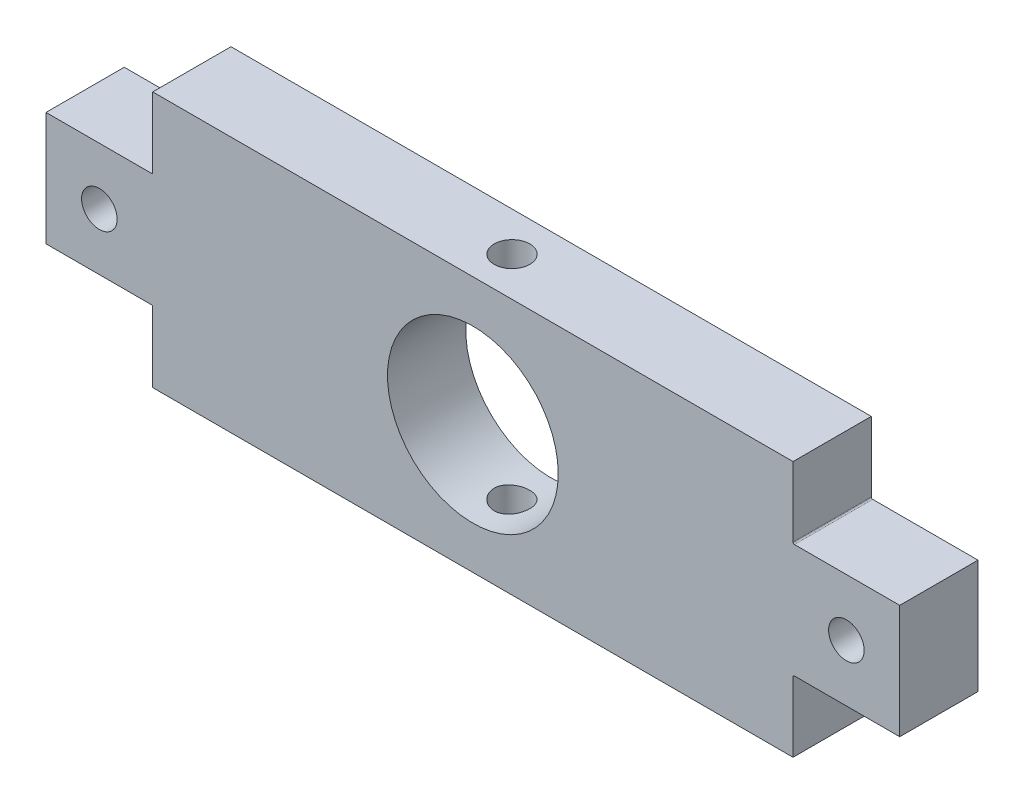
ISO-10303-21;
HEADER;
FILE_DESCRIPTION(('STEP AP214'),'2;1');
FILE_NAME('part.step','',(''),(''),'','','');
FILE_SCHEMA(('AUTOMOTIVE_DESIGN { 1 0 10303 214 1 1 1 1 }'));
ENDSEC;
DATA;
#1=APPLICATION_CONTEXT('core data for automotive mechanical design processes');
#2=APPLICATION_PROTOCOL_DEFINITION('international standard','automotive_design',2000,#1);
#3=PRODUCT_CONTEXT('',#1,'mechanical');
#4=PRODUCT('Part','Part','',(#3));
#5=PRODUCT_RELATED_PRODUCT_CATEGORY('part','',(#4));
#6=PRODUCT_DEFINITION_FORMATION('','',#4);
#7=PRODUCT_DEFINITION_CONTEXT('part definition',#1,'design');
#8=PRODUCT_DEFINITION('design','',#6,#7);
#9=PRODUCT_DEFINITION_SHAPE('','',#8);
#10=(LENGTH_UNIT() NAMED_UNIT(*) SI_UNIT(.MILLI.,.METRE.));
#11=(NAMED_UNIT(*) PLANE_ANGLE_UNIT() SI_UNIT($,.RADIAN.));
#12=(NAMED_UNIT(*) SI_UNIT($,.STERADIAN.) SOLID_ANGLE_UNIT());
#13=UNCERTAINTY_MEASURE_WITH_UNIT(LENGTH_MEASURE(1.E-05),#10,'distance_accuracy_value','');
#14=(GEOMETRIC_REPRESENTATION_CONTEXT(3) GLOBAL_UNCERTAINTY_ASSIGNED_CONTEXT((#13)) GLOBAL_UNIT_ASSIGNED_CONTEXT((#10,
#11,#12)) REPRESENTATION_CONTEXT('',''));
#15=CARTESIAN_POINT('',(0.,0.,0.));
#16=DIRECTION('',(0.,0.,1.));
#17=DIRECTION('',(1.,0.,0.));
#18=AXIS2_PLACEMENT_3D('',#15,#16,#17);
#19=CARTESIAN_POINT('',(45.,-18.,11.));
#20=DIRECTION('',(1.,0.,0.));
#21=DIRECTION('',(0.,1.,0.));
#22=AXIS2_PLACEMENT_3D('',#19,#20,#21);
#23=PLANE('',#22);
#24=DIRECTION('',(0.,-1.,0.));
#25=VECTOR('',#24,1.);
#26=CARTESIAN_POINT('',(45.,-18.,0.));
#27=LINE('',#26,#25);
#28=CARTESIAN_POINT('',(45.,-8.20000000000001,0.));
#29=VERTEX_POINT('',#28);
#30=CARTESIAN_POINT('',(45.,-18.,0.));
#31=VERTEX_POINT('',#30);
#32=EDGE_CURVE('E203',#29,#31,#27,.T.);
#33=ORIENTED_EDGE('',*,*,#32,.F.);
#34=DIRECTION('',(0.,0.,-1.));
#35=VECTOR('',#34,1.);
#36=CARTESIAN_POINT('',(45.,-8.20000000000001,11.));
#37=LINE('',#36,#35);
#38=CARTESIAN_POINT('',(45.,-8.20000000000001,11.));
#39=VERTEX_POINT('',#38);
#40=EDGE_CURVE('E157',#29,#39,#37,.F.);
#41=ORIENTED_EDGE('',*,*,#40,.T.);
#42=DIRECTION('',(0.,-1.,0.));
#43=VECTOR('',#42,1.);
#44=CARTESIAN_POINT('',(45.,-18.,11.));
#45=LINE('',#44,#43);
#46=CARTESIAN_POINT('',(45.,-18.,11.));
#47=VERTEX_POINT('',#46);
#48=EDGE_CURVE('E151',#39,#47,#45,.T.);
#49=ORIENTED_EDGE('',*,*,#48,.T.);
#50=DIRECTION('',(0.,0.,-1.));
#51=VECTOR('',#50,1.);
#52=CARTESIAN_POINT('',(45.,-18.,11.));
#53=LINE('',#52,#51);
#54=EDGE_CURVE('E154',#47,#31,#53,.T.);
#55=ORIENTED_EDGE('',*,*,#54,.T.);
#56=EDGE_LOOP('',(#33,#41,#49,#55));
#57=FACE_BOUND('',#56,.T.);
#58=ADVANCED_FACE('F40',(#57),#23,.T.);
#59=CARTESIAN_POINT('',(45.,-8.00000000000001,11.));
#60=DIRECTION('',(0.,-1.,0.));
#61=DIRECTION('',(1.,0.,0.));
#62=AXIS2_PLACEMENT_3D('',#59,#60,#61);
#63=PLANE('',#62);
#64=DIRECTION('',(-1.,0.,0.));
#65=VECTOR('',#64,1.);
#66=CARTESIAN_POINT('',(45.,-8.00000000000001,11.));
#67=LINE('',#66,#65);
#68=CARTESIAN_POINT('',(60.,-7.99999999999999,11.));
#69=VERTEX_POINT('',#68);
#70=CARTESIAN_POINT('',(45.2,-8.00000000000001,11.));
#71=VERTEX_POINT('',#70);
#72=EDGE_CURVE('E170',#69,#71,#67,.T.);
#73=ORIENTED_EDGE('',*,*,#72,.T.);
#74=DIRECTION('',(0.,0.,-1.));
#75=VECTOR('',#74,1.);
#76=CARTESIAN_POINT('',(45.2,-8.00000000000001,0.));
#77=LINE('',#76,#75);
#78=CARTESIAN_POINT('',(45.2,-8.00000000000001,0.));
#79=VERTEX_POINT('',#78);
#80=EDGE_CURVE('E234',#71,#79,#77,.T.);
#81=ORIENTED_EDGE('',*,*,#80,.T.);
#82=DIRECTION('',(-1.,0.,0.));
#83=VECTOR('',#82,1.);
#84=CARTESIAN_POINT('',(45.,-8.00000000000001,0.));
#85=LINE('',#84,#83);
#86=CARTESIAN_POINT('',(60.,-7.99999999999999,0.));
#87=VERTEX_POINT('',#86);
#88=EDGE_CURVE('E162',#87,#79,#85,.T.);
#89=ORIENTED_EDGE('',*,*,#88,.F.);
#90=DIRECTION('',(0.,0.,-1.));
#91=VECTOR('',#90,1.);
#92=CARTESIAN_POINT('',(60.,-7.99999999999999,11.));
#93=LINE('',#92,#91);
#94=EDGE_CURVE('E232',#69,#87,#93,.T.);
#95=ORIENTED_EDGE('',*,*,#94,.F.);
#96=EDGE_LOOP('',(#73,#81,#89,#95));
#97=FACE_BOUND('',#96,.T.);
#98=ADVANCED_FACE('F290',(#97),#63,.T.);
#99=CARTESIAN_POINT('',(60.,-7.99999999999999,11.));
#100=DIRECTION('',(1.,0.,0.));
#101=DIRECTION('',(0.,0.,-1.));
#102=AXIS2_PLACEMENT_3D('',#99,#100,#101);
#103=PLANE('',#102);
#104=DIRECTION('',(0.,-1.,0.));
#105=VECTOR('',#104,1.);
#106=CARTESIAN_POINT('',(60.,-7.99999999999999,0.));
#107=LINE('',#106,#105);
#108=CARTESIAN_POINT('',(60.,8.,0.));
#109=VERTEX_POINT('',#108);
#110=EDGE_CURVE('E227',#109,#87,#107,.T.);
#111=ORIENTED_EDGE('',*,*,#110,.F.);
#112=DIRECTION('',(0.,0.,-1.));
#113=VECTOR('',#112,1.);
#114=CARTESIAN_POINT('',(60.,8.,11.));
#115=LINE('',#114,#113);
#116=CARTESIAN_POINT('',(60.,8.,11.));
#117=VERTEX_POINT('',#116);
#118=EDGE_CURVE('E235',#117,#109,#115,.T.);
#119=ORIENTED_EDGE('',*,*,#118,.F.);
#120=DIRECTION('',(0.,-1.,0.));
#121=VECTOR('',#120,1.);
#122=CARTESIAN_POINT('',(60.,-7.99999999999999,11.));
#123=LINE('',#122,#121);
#124=EDGE_CURVE('E198',#117,#69,#123,.T.);
#125=ORIENTED_EDGE('',*,*,#124,.T.);
#126=ORIENTED_EDGE('',*,*,#94,.T.);
#127=EDGE_LOOP('',(#111,#119,#125,#126));
#128=FACE_BOUND('',#127,.T.);
#129=ADVANCED_FACE('F295',(#128),#103,.T.);
#130=CARTESIAN_POINT('',(60.,8.,11.));
#131=DIRECTION('',(0.,1.,0.));
#132=DIRECTION('',(-1.,0.,0.));
#133=AXIS2_PLACEMENT_3D('',#130,#131,#132);
#134=PLANE('',#133);
#135=DIRECTION('',(1.,0.,0.));
#136=VECTOR('',#135,1.);
#137=CARTESIAN_POINT('',(60.,8.,0.));
#138=LINE('',#137,#136);
#139=CARTESIAN_POINT('',(45.2,7.99999999999999,0.));
#140=VERTEX_POINT('',#139);
#141=EDGE_CURVE('E225',#140,#109,#138,.T.);
#142=ORIENTED_EDGE('',*,*,#141,.F.);
#143=DIRECTION('',(0.,0.,-1.));
#144=VECTOR('',#143,1.);
#145=CARTESIAN_POINT('',(45.2,7.99999999999999,11.));
#146=LINE('',#145,#144);
#147=CARTESIAN_POINT('',(45.2,7.99999999999999,11.));
#148=VERTEX_POINT('',#147);
#149=EDGE_CURVE('E337',#140,#148,#146,.F.);
#150=ORIENTED_EDGE('',*,*,#149,.T.);
#151=DIRECTION('',(1.,0.,0.));
#152=VECTOR('',#151,1.);
#153=CARTESIAN_POINT('',(60.,8.,11.));
#154=LINE('',#153,#152);
#155=EDGE_CURVE('E196',#148,#117,#154,.T.);
#156=ORIENTED_EDGE('',*,*,#155,.T.);
#157=ORIENTED_EDGE('',*,*,#118,.T.);
#158=EDGE_LOOP('',(#142,#150,#156,#157));
#159=FACE_BOUND('',#158,.T.);
#160=ADVANCED_FACE('F444',(#159),#134,.T.);
#161=CARTESIAN_POINT('',(45.,7.99999999999999,11.));
#162=DIRECTION('',(1.,0.,0.));
#163=DIRECTION('',(0.,1.,0.));
#164=AXIS2_PLACEMENT_3D('',#161,#162,#163);
#165=PLANE('',#164);
#166=DIRECTION('',(0.,-1.,0.));
#167=VECTOR('',#166,1.);
#168=CARTESIAN_POINT('',(45.,7.99999999999999,11.));
#169=LINE('',#168,#167);
#170=CARTESIAN_POINT('',(45.,18.,11.));
#171=VERTEX_POINT('',#170);
#172=CARTESIAN_POINT('',(45.,8.19999999999999,11.));
#173=VERTEX_POINT('',#172);
#174=EDGE_CURVE('E193',#171,#173,#169,.T.);
#175=ORIENTED_EDGE('',*,*,#174,.T.);
#176=DIRECTION('',(0.,0.,-1.));
#177=VECTOR('',#176,1.);
#178=CARTESIAN_POINT('',(45.,8.19999999999999,0.));
#179=LINE('',#178,#177);
#180=CARTESIAN_POINT('',(45.,8.19999999999999,0.));
#181=VERTEX_POINT('',#180);
#182=EDGE_CURVE('E339',#173,#181,#179,.T.);
#183=ORIENTED_EDGE('',*,*,#182,.T.);
#184=DIRECTION('',(0.,-1.,0.));
#185=VECTOR('',#184,1.);
#186=CARTESIAN_POINT('',(45.,7.99999999999999,0.));
#187=LINE('',#186,#185);
#188=CARTESIAN_POINT('',(45.,18.,0.));
#189=VERTEX_POINT('',#188);
#190=EDGE_CURVE('E222',#189,#181,#187,.T.);
#191=ORIENTED_EDGE('',*,*,#190,.F.);
#192=DIRECTION('',(0.,0.,-1.));
#193=VECTOR('',#192,1.);
#194=CARTESIAN_POINT('',(45.,18.,11.));
#195=LINE('',#194,#193);
#196=EDGE_CURVE('E238',#171,#189,#195,.T.);
#197=ORIENTED_EDGE('',*,*,#196,.F.);
#198=EDGE_LOOP('',(#175,#183,#191,#197));
#199=FACE_BOUND('',#198,.T.);
#200=ADVANCED_FACE('F360',(#199),#165,.T.);
#201=CARTESIAN_POINT('',(45.,18.,11.));
#202=DIRECTION('',(0.,1.,0.));
#203=DIRECTION('',(-1.,0.,0.));
#204=AXIS2_PLACEMENT_3D('',#201,#202,#203);
#205=PLANE('',#204);
#206=CARTESIAN_POINT('',(0.,18.,5.5));
#207=DIRECTION('',(0.,-1.,0.));
#208=DIRECTION('',(0.,0.,-1.));
#209=AXIS2_PLACEMENT_3D('',#206,#207,#208);
#210=CIRCLE('',#209,2.5);
#211=CARTESIAN_POINT('',(0.,18.,3.));
#212=VERTEX_POINT('',#211);
#213=EDGE_CURVE('E258',#212,#212,#210,.T.);
#214=ORIENTED_EDGE('',*,*,#213,.T.);
#215=EDGE_LOOP('',(#214));
#216=FACE_BOUND('',#215,.T.);
#217=DIRECTION('',(1.,0.,0.));
#218=VECTOR('',#217,1.);
#219=CARTESIAN_POINT('',(45.,18.,0.));
#220=LINE('',#219,#218);
#221=CARTESIAN_POINT('',(-45.,18.,0.));
#222=VERTEX_POINT('',#221);
#223=EDGE_CURVE('E219',#222,#189,#220,.T.);
#224=ORIENTED_EDGE('',*,*,#223,.F.);
#225=DIRECTION('',(0.,0.,-1.));
#226=VECTOR('',#225,1.);
#227=CARTESIAN_POINT('',(-45.,18.,11.));
#228=LINE('',#227,#226);
#229=CARTESIAN_POINT('',(-45.,18.,11.));
#230=VERTEX_POINT('',#229);
#231=EDGE_CURVE('E240',#230,#222,#228,.T.);
#232=ORIENTED_EDGE('',*,*,#231,.F.);
#233=DIRECTION('',(1.,0.,0.));
#234=VECTOR('',#233,1.);
#235=CARTESIAN_POINT('',(45.,18.,11.));
#236=LINE('',#235,#234);
#237=EDGE_CURVE('E190',#230,#171,#236,.T.);
#238=ORIENTED_EDGE('',*,*,#237,.T.);
#239=ORIENTED_EDGE('',*,*,#196,.T.);
#240=EDGE_LOOP('',(#224,#232,#238,#239));
#241=FACE_BOUND('',#240,.T.);
#242=ADVANCED_FACE('F365',(#216,#241),#205,.T.);
#243=CARTESIAN_POINT('',(-45.,18.,11.));
#244=DIRECTION('',(-1.,0.,0.));
#245=DIRECTION('',(0.,0.,1.));
#246=AXIS2_PLACEMENT_3D('',#243,#244,#245);
#247=PLANE('',#246);
#248=DIRECTION('',(0.,1.,0.));
#249=VECTOR('',#248,1.);
#250=CARTESIAN_POINT('',(-45.,18.,0.));
#251=LINE('',#250,#249);
#252=CARTESIAN_POINT('',(-45.,8.20000000000002,0.));
#253=VERTEX_POINT('',#252);
#254=EDGE_CURVE('E217',#253,#222,#251,.T.);
#255=ORIENTED_EDGE('',*,*,#254,.F.);
#256=DIRECTION('',(0.,0.,-1.));
#257=VECTOR('',#256,1.);
#258=CARTESIAN_POINT('',(-45.,8.20000000000002,11.));
#259=LINE('',#258,#257);
#260=CARTESIAN_POINT('',(-45.,8.20000000000002,11.));
#261=VERTEX_POINT('',#260);
#262=EDGE_CURVE('E314',#253,#261,#259,.F.);
#263=ORIENTED_EDGE('',*,*,#262,.T.);
#264=DIRECTION('',(0.,1.,0.));
#265=VECTOR('',#264,1.);
#266=CARTESIAN_POINT('',(-45.,18.,11.));
#267=LINE('',#266,#265);
#268=EDGE_CURVE('E188',#261,#230,#267,.T.);
#269=ORIENTED_EDGE('',*,*,#268,.T.);
#270=ORIENTED_EDGE('',*,*,#231,.T.);
#271=EDGE_LOOP('',(#255,#263,#269,#270));
#272=FACE_BOUND('',#271,.T.);
#273=ADVANCED_FACE('F368',(#272),#247,.T.);
#274=CARTESIAN_POINT('',(-45.,8.00000000000001,11.));
#275=DIRECTION('',(0.,1.,0.));
#276=DIRECTION('',(-1.,0.,0.));
#277=AXIS2_PLACEMENT_3D('',#274,#275,#276);
#278=PLANE('',#277);
#279=DIRECTION('',(1.,0.,0.));
#280=VECTOR('',#279,1.);
#281=CARTESIAN_POINT('',(-45.,8.00000000000001,11.));
#282=LINE('',#281,#280);
#283=CARTESIAN_POINT('',(-60.,8.,11.));
#284=VERTEX_POINT('',#283);
#285=CARTESIAN_POINT('',(-45.2,8.00000000000001,11.));
#286=VERTEX_POINT('',#285);
#287=EDGE_CURVE('E185',#284,#286,#282,.T.);
#288=ORIENTED_EDGE('',*,*,#287,.T.);
#289=DIRECTION('',(0.,0.,-1.));
#290=VECTOR('',#289,1.);
#291=CARTESIAN_POINT('',(-45.2,8.00000000000001,0.));
#292=LINE('',#291,#290);
#293=CARTESIAN_POINT('',(-45.2,8.00000000000001,0.));
#294=VERTEX_POINT('',#293);
#295=EDGE_CURVE('E316',#286,#294,#292,.T.);
#296=ORIENTED_EDGE('',*,*,#295,.T.);
#297=DIRECTION('',(1.,0.,0.));
#298=VECTOR('',#297,1.);
#299=CARTESIAN_POINT('',(-45.,8.00000000000001,0.));
#300=LINE('',#299,#298);
#301=CARTESIAN_POINT('',(-60.,8.,0.));
#302=VERTEX_POINT('',#301);
#303=EDGE_CURVE('E214',#302,#294,#300,.T.);
#304=ORIENTED_EDGE('',*,*,#303,.F.);
#305=DIRECTION('',(0.,0.,-1.));
#306=VECTOR('',#305,1.);
#307=CARTESIAN_POINT('',(-60.,8.,11.));
#308=LINE('',#307,#306);
#309=EDGE_CURVE('E243',#284,#302,#308,.T.);
#310=ORIENTED_EDGE('',*,*,#309,.F.);
#311=EDGE_LOOP('',(#288,#296,#304,#310));
#312=FACE_BOUND('',#311,.T.);
#313=ADVANCED_FACE('F370',(#312),#278,.T.);
#314=CARTESIAN_POINT('',(-60.,8.,11.));
#315=DIRECTION('',(-1.,0.,0.));
#316=DIRECTION('',(0.,0.,1.));
#317=AXIS2_PLACEMENT_3D('',#314,#315,#316);
#318=PLANE('',#317);
#319=DIRECTION('',(0.,1.,0.));
#320=VECTOR('',#319,1.);
#321=CARTESIAN_POINT('',(-60.,8.,0.));
#322=LINE('',#321,#320);
#323=CARTESIAN_POINT('',(-60.,-7.99999999999999,0.));
#324=VERTEX_POINT('',#323);
#325=EDGE_CURVE('E211',#324,#302,#322,.T.);
#326=ORIENTED_EDGE('',*,*,#325,.F.);
#327=DIRECTION('',(0.,0.,-1.));
#328=VECTOR('',#327,1.);
#329=CARTESIAN_POINT('',(-60.,-7.99999999999999,11.));
#330=LINE('',#329,#328);
#331=CARTESIAN_POINT('',(-60.,-7.99999999999999,11.));
#332=VERTEX_POINT('',#331);
#333=EDGE_CURVE('E245',#332,#324,#330,.T.);
#334=ORIENTED_EDGE('',*,*,#333,.F.);
#335=DIRECTION('',(0.,1.,0.));
#336=VECTOR('',#335,1.);
#337=CARTESIAN_POINT('',(-60.,8.,11.));
#338=LINE('',#337,#336);
#339=EDGE_CURVE('E182',#332,#284,#338,.T.);
#340=ORIENTED_EDGE('',*,*,#339,.T.);
#341=ORIENTED_EDGE('',*,*,#309,.T.);
#342=EDGE_LOOP('',(#326,#334,#340,#341));
#343=FACE_BOUND('',#342,.T.);
#344=ADVANCED_FACE('F376',(#343),#318,.T.);
#345=CARTESIAN_POINT('',(-60.,-7.99999999999999,11.));
#346=DIRECTION('',(0.,-1.,0.));
#347=DIRECTION('',(1.,0.,0.));
#348=AXIS2_PLACEMENT_3D('',#345,#346,#347);
#349=PLANE('',#348);
#350=DIRECTION('',(-1.,0.,0.));
#351=VECTOR('',#350,1.);
#352=CARTESIAN_POINT('',(-60.,-7.99999999999999,0.));
#353=LINE('',#352,#351);
#354=CARTESIAN_POINT('',(-45.2,-8.00000000000001,0.));
#355=VERTEX_POINT('',#354);
#356=EDGE_CURVE('E209',#355,#324,#353,.T.);
#357=ORIENTED_EDGE('',*,*,#356,.F.);
#358=DIRECTION('',(0.,0.,-1.));
#359=VECTOR('',#358,1.);
#360=CARTESIAN_POINT('',(-45.2,-8.00000000000001,11.));
#361=LINE('',#360,#359);
#362=CARTESIAN_POINT('',(-45.2,-8.00000000000001,11.));
#363=VERTEX_POINT('',#362);
#364=EDGE_CURVE('E55',#355,#363,#361,.F.);
#365=ORIENTED_EDGE('',*,*,#364,.T.);
#366=DIRECTION('',(-1.,0.,0.));
#367=VECTOR('',#366,1.);
#368=CARTESIAN_POINT('',(-60.,-7.99999999999999,11.));
#369=LINE('',#368,#367);
#370=EDGE_CURVE('E177',#363,#332,#369,.T.);
#371=ORIENTED_EDGE('',*,*,#370,.T.);
#372=ORIENTED_EDGE('',*,*,#333,.T.);
#373=EDGE_LOOP('',(#357,#365,#371,#372));
#374=FACE_BOUND('',#373,.T.);
#375=ADVANCED_FACE('F385',(#374),#349,.T.);
#376=CARTESIAN_POINT('',(-45.,-8.00000000000001,11.));
#377=DIRECTION('',(-1.,0.,0.));
#378=DIRECTION('',(0.,-1.,0.));
#379=AXIS2_PLACEMENT_3D('',#376,#377,#378);
#380=PLANE('',#379);
#381=DIRECTION('',(0.,1.,0.));
#382=VECTOR('',#381,1.);
#383=CARTESIAN_POINT('',(-45.,-8.00000000000001,11.));
#384=LINE('',#383,#382);
#385=CARTESIAN_POINT('',(-45.,-18.,11.));
#386=VERTEX_POINT('',#385);
#387=CARTESIAN_POINT('',(-45.,-8.20000000000001,11.));
#388=VERTEX_POINT('',#387);
#389=EDGE_CURVE('E175',#386,#388,#384,.T.);
#390=ORIENTED_EDGE('',*,*,#389,.T.);
#391=DIRECTION('',(0.,0.,-1.));
#392=VECTOR('',#391,1.);
#393=CARTESIAN_POINT('',(-45.,-8.20000000000001,0.));
#394=LINE('',#393,#392);
#395=CARTESIAN_POINT('',(-45.,-8.20000000000001,0.));
#396=VERTEX_POINT('',#395);
#397=EDGE_CURVE('E332',#388,#396,#394,.T.);
#398=ORIENTED_EDGE('',*,*,#397,.T.);
#399=DIRECTION('',(0.,1.,0.));
#400=VECTOR('',#399,1.);
#401=CARTESIAN_POINT('',(-45.,-8.00000000000001,0.));
#402=LINE('',#401,#400);
#403=CARTESIAN_POINT('',(-45.,-18.,0.));
#404=VERTEX_POINT('',#403);
#405=EDGE_CURVE('E207',#404,#396,#402,.T.);
#406=ORIENTED_EDGE('',*,*,#405,.F.);
#407=DIRECTION('',(0.,0.,-1.));
#408=VECTOR('',#407,1.);
#409=CARTESIAN_POINT('',(-45.,-18.,11.));
#410=LINE('',#409,#408);
#411=EDGE_CURVE('E169',#386,#404,#410,.T.);
#412=ORIENTED_EDGE('',*,*,#411,.F.);
#413=EDGE_LOOP('',(#390,#398,#406,#412));
#414=FACE_BOUND('',#413,.T.);
#415=ADVANCED_FACE('F388',(#414),#380,.T.);
#416=CARTESIAN_POINT('',(-45.,-18.,11.));
#417=DIRECTION('',(0.,-1.,0.));
#418=DIRECTION('',(0.,0.,-1.));
#419=AXIS2_PLACEMENT_3D('',#416,#417,#418);
#420=PLANE('',#419);
#421=CARTESIAN_POINT('',(0.,-18.,5.5));
#422=DIRECTION('',(0.,-1.,0.));
#423=DIRECTION('',(0.,0.,-1.));
#424=AXIS2_PLACEMENT_3D('',#421,#422,#423);
#425=CIRCLE('',#424,2.5);
#426=CARTESIAN_POINT('',(0.,-18.,3.));
#427=VERTEX_POINT('',#426);
#428=EDGE_CURVE('E408',#427,#427,#425,.T.);
#429=ORIENTED_EDGE('',*,*,#428,.F.);
#430=EDGE_LOOP('',(#429));
#431=FACE_BOUND('',#430,.T.);
#432=DIRECTION('',(-1.,0.,0.));
#433=VECTOR('',#432,1.);
#434=CARTESIAN_POINT('',(-45.,-18.,0.));
#435=LINE('',#434,#433);
#436=EDGE_CURVE('E168',#31,#404,#435,.T.);
#437=ORIENTED_EDGE('',*,*,#436,.F.);
#438=ORIENTED_EDGE('',*,*,#54,.F.);
#439=DIRECTION('',(-1.,0.,0.));
#440=VECTOR('',#439,1.);
#441=CARTESIAN_POINT('',(-45.,-18.,11.));
#442=LINE('',#441,#440);
#443=EDGE_CURVE('E161',#47,#386,#442,.T.);
#444=ORIENTED_EDGE('',*,*,#443,.T.);
#445=ORIENTED_EDGE('',*,*,#411,.T.);
#446=EDGE_LOOP('',(#437,#438,#444,#445));
#447=FACE_BOUND('',#446,.T.);
#448=ADVANCED_FACE('F166',(#431,#447),#420,.T.);
#449=CARTESIAN_POINT('',(0.,0.,11.));
#450=DIRECTION('',(0.,0.,-1.));
#451=DIRECTION('',(-1.,0.,0.));
#452=AXIS2_PLACEMENT_3D('',#449,#450,#451);
#453=PLANE('',#452);
#454=CARTESIAN_POINT('',(-52.5,0.,11.));
#455=DIRECTION('',(0.,0.,1.));
#456=DIRECTION('',(1.,0.,0.));
#457=AXIS2_PLACEMENT_3D('',#454,#455,#456);
#458=CIRCLE('',#457,2.49999999999999);
#459=CARTESIAN_POINT('',(-50.,0.,11.));
#460=VERTEX_POINT('',#459);
#461=EDGE_CURVE('E579',#460,#460,#458,.T.);
#462=ORIENTED_EDGE('',*,*,#461,.F.);
#463=EDGE_LOOP('',(#462));
#464=FACE_BOUND('',#463,.T.);
#465=CARTESIAN_POINT('',(52.5,0.,11.));
#466=DIRECTION('',(0.,0.,1.));
#467=DIRECTION('',(1.,0.,0.));
#468=AXIS2_PLACEMENT_3D('',#465,#466,#467);
#469=CIRCLE('',#468,2.49999999999999);
#470=CARTESIAN_POINT('',(55.,0.,11.));
#471=VERTEX_POINT('',#470);
#472=EDGE_CURVE('E415',#471,#471,#469,.T.);
#473=ORIENTED_EDGE('',*,*,#472,.F.);
#474=EDGE_LOOP('',(#473));
#475=FACE_BOUND('',#474,.T.);
#476=CARTESIAN_POINT('',(0.,0.,11.));
#477=DIRECTION('',(0.,0.,1.));
#478=DIRECTION('',(1.,0.,0.));
#479=AXIS2_PLACEMENT_3D('',#476,#477,#478);
#480=CIRCLE('',#479,12.);
#481=CARTESIAN_POINT('',(12.,0.,11.));
#482=VERTEX_POINT('',#481);
#483=EDGE_CURVE('E420',#482,#482,#480,.T.);
#484=ORIENTED_EDGE('',*,*,#483,.F.);
#485=EDGE_LOOP('',(#484));
#486=FACE_BOUND('',#485,.T.);
#487=ORIENTED_EDGE('',*,*,#48,.F.);
#488=CARTESIAN_POINT('',(45.2,-8.20000000000001,11.));
#489=DIRECTION('',(0.,0.,-1.));
#490=DIRECTION('',(-1.,0.,0.));
#491=AXIS2_PLACEMENT_3D('',#488,#489,#490);
#492=CIRCLE('',#491,0.2);
#493=EDGE_CURVE('E327',#39,#71,#492,.T.);
#494=ORIENTED_EDGE('',*,*,#493,.T.);
#495=ORIENTED_EDGE('',*,*,#72,.F.);
#496=ORIENTED_EDGE('',*,*,#124,.F.);
#497=ORIENTED_EDGE('',*,*,#155,.F.);
#498=CARTESIAN_POINT('',(45.2,8.19999999999999,11.));
#499=DIRECTION('',(0.,0.,-1.));
#500=DIRECTION('',(-1.,0.,0.));
#501=AXIS2_PLACEMENT_3D('',#498,#499,#500);
#502=CIRCLE('',#501,0.2);
#503=EDGE_CURVE('E321',#148,#173,#502,.T.);
#504=ORIENTED_EDGE('',*,*,#503,.T.);
#505=ORIENTED_EDGE('',*,*,#174,.F.);
#506=ORIENTED_EDGE('',*,*,#237,.F.);
#507=ORIENTED_EDGE('',*,*,#268,.F.);
#508=CARTESIAN_POINT('',(-45.2,8.20000000000002,11.));
#509=DIRECTION('',(0.,0.,-1.));
#510=DIRECTION('',(-1.,0.,0.));
#511=AXIS2_PLACEMENT_3D('',#508,#509,#510);
#512=CIRCLE('',#511,0.2);
#513=EDGE_CURVE('E313',#261,#286,#512,.T.);
#514=ORIENTED_EDGE('',*,*,#513,.T.);
#515=ORIENTED_EDGE('',*,*,#287,.F.);
#516=ORIENTED_EDGE('',*,*,#339,.F.);
#517=ORIENTED_EDGE('',*,*,#370,.F.);
#518=CARTESIAN_POINT('',(-45.2,-8.20000000000001,11.));
#519=DIRECTION('',(0.,0.,-1.));
#520=DIRECTION('',(-1.,0.,0.));
#521=AXIS2_PLACEMENT_3D('',#518,#519,#520);
#522=CIRCLE('',#521,0.2);
#523=EDGE_CURVE('E11',#363,#388,#522,.T.);
#524=ORIENTED_EDGE('',*,*,#523,.T.);
#525=ORIENTED_EDGE('',*,*,#389,.F.);
#526=ORIENTED_EDGE('',*,*,#443,.F.);
#527=EDGE_LOOP('',(#487,#494,#495,#496,#497,#504,#505,#506,#507,#514,#515,#516,#517,#524,#525,#526));
#528=FACE_BOUND('',#527,.T.);
#529=ADVANCED_FACE('F173',(#464,#475,#486,#528),#453,.F.);
#530=CARTESIAN_POINT('',(0.,0.,0.));
#531=DIRECTION('',(0.,0.,-1.));
#532=DIRECTION('',(-1.,0.,0.));
#533=AXIS2_PLACEMENT_3D('',#530,#531,#532);
#534=PLANE('',#533);
#535=CARTESIAN_POINT('',(-52.5,0.,0.));
#536=DIRECTION('',(0.,0.,1.));
#537=DIRECTION('',(1.,0.,0.));
#538=AXIS2_PLACEMENT_3D('',#535,#536,#537);
#539=CIRCLE('',#538,2.5);
#540=CARTESIAN_POINT('',(-50.,0.,0.));
#541=VERTEX_POINT('',#540);
#542=EDGE_CURVE('E573',#541,#541,#539,.T.);
#543=ORIENTED_EDGE('',*,*,#542,.T.);
#544=EDGE_LOOP('',(#543));
#545=FACE_BOUND('',#544,.T.);
#546=CARTESIAN_POINT('',(52.5,0.,0.));
#547=DIRECTION('',(0.,0.,1.));
#548=DIRECTION('',(1.,0.,0.));
#549=AXIS2_PLACEMENT_3D('',#546,#547,#548);
#550=CIRCLE('',#549,2.5);
#551=CARTESIAN_POINT('',(55.,0.,0.));
#552=VERTEX_POINT('',#551);
#553=EDGE_CURVE('E410',#552,#552,#550,.T.);
#554=ORIENTED_EDGE('',*,*,#553,.T.);
#555=EDGE_LOOP('',(#554));
#556=FACE_BOUND('',#555,.T.);
#557=CARTESIAN_POINT('',(0.,0.,0.));
#558=DIRECTION('',(0.,0.,1.));
#559=DIRECTION('',(1.,0.,0.));
#560=AXIS2_PLACEMENT_3D('',#557,#558,#559);
#561=CIRCLE('',#560,12.);
#562=CARTESIAN_POINT('',(12.,0.,0.));
#563=VERTEX_POINT('',#562);
#564=EDGE_CURVE('E205',#563,#563,#561,.T.);
#565=ORIENTED_EDGE('',*,*,#564,.T.);
#566=EDGE_LOOP('',(#565));
#567=FACE_BOUND('',#566,.T.);
#568=ORIENTED_EDGE('',*,*,#88,.T.);
#569=CARTESIAN_POINT('',(45.2,-8.20000000000001,0.));
#570=DIRECTION('',(0.,0.,-1.));
#571=DIRECTION('',(-1.,0.,0.));
#572=AXIS2_PLACEMENT_3D('',#569,#570,#571);
#573=CIRCLE('',#572,0.2);
#574=EDGE_CURVE('E329',#79,#29,#573,.F.);
#575=ORIENTED_EDGE('',*,*,#574,.T.);
#576=ORIENTED_EDGE('',*,*,#32,.T.);
#577=ORIENTED_EDGE('',*,*,#436,.T.);
#578=ORIENTED_EDGE('',*,*,#405,.T.);
#579=CARTESIAN_POINT('',(-45.2,-8.20000000000001,0.));
#580=DIRECTION('',(0.,0.,-1.));
#581=DIRECTION('',(-1.,0.,0.));
#582=AXIS2_PLACEMENT_3D('',#579,#580,#581);
#583=CIRCLE('',#582,0.2);
#584=EDGE_CURVE('E48',#396,#355,#583,.F.);
#585=ORIENTED_EDGE('',*,*,#584,.T.);
#586=ORIENTED_EDGE('',*,*,#356,.T.);
#587=ORIENTED_EDGE('',*,*,#325,.T.);
#588=ORIENTED_EDGE('',*,*,#303,.T.);
#589=CARTESIAN_POINT('',(-45.2,8.20000000000002,0.));
#590=DIRECTION('',(0.,0.,-1.));
#591=DIRECTION('',(-1.,0.,0.));
#592=AXIS2_PLACEMENT_3D('',#589,#590,#591);
#593=CIRCLE('',#592,0.2);
#594=EDGE_CURVE('E319',#294,#253,#593,.F.);
#595=ORIENTED_EDGE('',*,*,#594,.T.);
#596=ORIENTED_EDGE('',*,*,#254,.T.);
#597=ORIENTED_EDGE('',*,*,#223,.T.);
#598=ORIENTED_EDGE('',*,*,#190,.T.);
#599=CARTESIAN_POINT('',(45.2,8.19999999999999,0.));
#600=DIRECTION('',(0.,0.,-1.));
#601=DIRECTION('',(-1.,0.,0.));
#602=AXIS2_PLACEMENT_3D('',#599,#600,#601);
#603=CIRCLE('',#602,0.2);
#604=EDGE_CURVE('E325',#181,#140,#603,.F.);
#605=ORIENTED_EDGE('',*,*,#604,.T.);
#606=ORIENTED_EDGE('',*,*,#141,.T.);
#607=ORIENTED_EDGE('',*,*,#110,.T.);
#608=EDGE_LOOP('',(#568,#575,#576,#577,#578,#585,#586,#587,#588,#595,#596,#597,#598,#605,#606,#607));
#609=FACE_BOUND('',#608,.T.);
#610=ADVANCED_FACE('F346',(#545,#556,#567,#609),#534,.T.);
#611=CARTESIAN_POINT('',(0.,0.,0.));
#612=DIRECTION('',(0.,0.,1.));
#613=DIRECTION('',(1.,0.,0.));
#614=AXIS2_PLACEMENT_3D('',#611,#612,#613);
#615=CYLINDRICAL_SURFACE('',#614,12.);
#616=CARTESIAN_POINT('',(0.,12.,3.));
#617=CARTESIAN_POINT('',(-0.138818083403321,11.999997430533,3.00000495493845));
#618=CARTESIAN_POINT('',(-0.277697579041751,11.9975665755009,3.0116013314375));
#619=CARTESIAN_POINT('',(-0.551522632533986,11.9881040198136,3.0576386990657));
#620=CARTESIAN_POINT('',(-0.686465120256625,11.981068823785,3.09209704607386));
#621=CARTESIAN_POINT('',(-0.948418264582683,11.963182183924,3.18274090984364));
#622=CARTESIAN_POINT('',(-1.07543667341837,11.9523345410529,3.23890479199777));
#623=CARTESIAN_POINT('',(-1.31824065721192,11.9279985561972,3.37129921771236));
#624=CARTESIAN_POINT('',(-1.43402673506865,11.9145103325195,3.44752886231166));
#625=CARTESIAN_POINT('',(-1.65278064861767,11.886154000493,3.61907268038129));
#626=CARTESIAN_POINT('',(-1.75556048832537,11.8712701169706,3.71462400247016));
#627=CARTESIAN_POINT('',(-1.94375555353878,11.841913153849,3.92158931839022));
#628=CARTESIAN_POINT('',(-2.02916934192197,11.8274401083337,4.03300462374453));
#629=CARTESIAN_POINT('',(-2.18102063354433,11.8003888519062,4.26990393753232));
#630=CARTESIAN_POINT('',(-2.24726109361302,11.7878309034966,4.39551676900549));
#631=CARTESIAN_POINT('',(-2.35762238696127,11.7662568130004,4.65639490354551));
#632=CARTESIAN_POINT('',(-2.40174560335283,11.7572402893514,4.79165916488507));
#633=CARTESIAN_POINT('',(-2.46600480267474,11.7439300197225,5.06597047483128));
#634=CARTESIAN_POINT('',(-2.48647195393597,11.7395711371173,5.20493671866953));
#635=CARTESIAN_POINT('',(-2.50386715311229,11.7358738143298,5.48439368572526));
#636=CARTESIAN_POINT('',(-2.50079781789373,11.7365348160196,5.62488423773059));
#637=CARTESIAN_POINT('',(-2.47147438074394,11.7427434863835,5.90096205595035));
#638=CARTESIAN_POINT('',(-2.44560210465441,11.748210673598,6.03659195932242));
#639=CARTESIAN_POINT('',(-2.3720108705989,11.7632887523188,6.30154301928985));
#640=CARTESIAN_POINT('',(-2.32429078962763,11.7728998568263,6.43086385121266));
#641=CARTESIAN_POINT('',(-2.20800006427857,11.795263829282,6.68061445683196));
#642=CARTESIAN_POINT('',(-2.13928005068474,11.8080390757117,6.80097259305415));
#643=CARTESIAN_POINT('',(-1.98304539854963,11.8352778002144,7.02859148853632));
#644=CARTESIAN_POINT('',(-1.89552842452517,11.8497414879707,7.13585061767195));
#645=CARTESIAN_POINT('',(-1.70214984309356,11.8790746185982,7.33642792216074));
#646=CARTESIAN_POINT('',(-1.59596286682416,11.8939464639895,7.42943233779403));
#647=CARTESIAN_POINT('',(-1.3693345772236,11.92216176286,7.59636088445794));
#648=CARTESIAN_POINT('',(-1.24889305005153,11.9355051934047,7.67028472919679));
#649=CARTESIAN_POINT('',(-0.996811082470958,11.9591974188563,7.7970201630719));
#650=CARTESIAN_POINT('',(-0.865150923853001,11.9695407942052,7.84979360913424));
#651=CARTESIAN_POINT('',(-0.594569241944311,11.9860267642256,7.93238340967098));
#652=CARTESIAN_POINT('',(-0.45564867719018,11.9921699119211,7.9622027864628));
#653=CARTESIAN_POINT('',(-0.177183731401671,11.9994855043091,7.99758850413577));
#654=CARTESIAN_POINT('',(-0.0376961110523583,12.0007458707516,8.0035838829885));
#655=CARTESIAN_POINT('',(0.240287597515427,11.9983990450555,7.99231010006179));
#656=CARTESIAN_POINT('',(0.378783745924514,11.9947921509631,7.9750423627968));
#657=CARTESIAN_POINT('',(0.649452734239625,11.9831712995837,7.91808869306093));
#658=CARTESIAN_POINT('',(0.78167438578841,11.9752010573615,7.87862502923306));
#659=CARTESIAN_POINT('',(1.03762289332266,11.9557445448479,7.77864427915718));
#660=CARTESIAN_POINT('',(1.16134907267355,11.9442579948916,7.71812551826804));
#661=CARTESIAN_POINT('',(1.39858861388699,11.9188248298143,7.57683924352488));
#662=CARTESIAN_POINT('',(1.51194643893967,11.9048478762466,7.49581614086188));
#663=CARTESIAN_POINT('',(1.72361089177304,11.8760513659942,7.31616087384746));
#664=CARTESIAN_POINT('',(1.82191575582657,11.8612317108502,7.21752664896212));
#665=CARTESIAN_POINT('',(2.0023572973036,11.8321204906275,7.0034888460006));
#666=CARTESIAN_POINT('',(2.08419829200408,11.81784178615,6.88783393608944));
#667=CARTESIAN_POINT('',(2.22729438158487,11.7917120203161,6.64416743157243));
#668=CARTESIAN_POINT('',(2.28855033355728,11.779860857893,6.51615635172179));
#669=CARTESIAN_POINT('',(2.38834492887844,11.7600340141608,6.25207760740354));
#670=CARTESIAN_POINT('',(2.42700619656063,11.7520374556937,6.11605792566833));
#671=CARTESIAN_POINT('',(2.48088077046814,11.7407836941939,5.83926689901548));
#672=CARTESIAN_POINT('',(2.49609743088882,11.7375258132073,5.69849623676112));
#673=CARTESIAN_POINT('',(2.50251852975222,11.7361581461701,5.41917319800071));
#674=CARTESIAN_POINT('',(2.49419085245451,11.73794804643,5.28063185955589));
#675=CARTESIAN_POINT('',(2.45479810628063,11.7462489450986,5.00697198215956));
#676=CARTESIAN_POINT('',(2.42373325564532,11.7527598981925,4.87185341036779));
#677=CARTESIAN_POINT('',(2.3399643553717,11.7697226489543,4.60920445621868));
#678=CARTESIAN_POINT('',(2.28732235136843,11.7801631401586,4.48165350702615));
#679=CARTESIAN_POINT('',(2.16194914599515,11.8038141147748,4.23712244794667));
#680=CARTESIAN_POINT('',(2.0892160796606,11.8170248553092,4.12014332073375));
#681=CARTESIAN_POINT('',(1.92414739068482,11.8450315910229,3.89775674584111));
#682=CARTESIAN_POINT('',(1.83147578083645,11.8598522773681,3.79260175087003));
#683=CARTESIAN_POINT('',(1.62984887623067,11.8892367916643,3.59918101354728));
#684=CARTESIAN_POINT('',(1.52088983766594,11.9038005596976,3.51091916489703));
#685=CARTESIAN_POINT('',(1.28826885501541,11.9312288909528,3.35282285363188));
#686=CARTESIAN_POINT('',(1.1644518430427,11.9440719214649,3.28321264022743));
#687=CARTESIAN_POINT('',(0.906639687996908,11.9663981698818,3.16589954313995));
#688=CARTESIAN_POINT('',(0.772653563814488,11.975884323642,3.11817750563625));
#689=CARTESIAN_POINT('',(0.532030585800211,11.9886499956289,3.05491944342315));
#690=CARTESIAN_POINT('',(0.426735187455858,11.9928807132279,3.03436247358229));
#691=CARTESIAN_POINT('',(0.214305348353074,11.9985566557952,3.00690109144534));
#692=CARTESIAN_POINT('',(0.107170975697744,12.0000019836917,2.99999617466562));
#693=CARTESIAN_POINT('',(0.,12.,3.));
#694=B_SPLINE_CURVE_WITH_KNOTS('',3,(#616,#617,#618,#619,#620,#621,#622,#623,#624,#625,#626,
#627,#628,#629,#630,#631,#632,#633,#634,#635,#636,#637,#638,#639,#640,#641,#642,#643,#644,#645,
#646,#647,#648,#649,#650,#651,#652,#653,#654,#655,#656,#657,#658,#659,#660,#661,#662,#663,#664,
#665,#666,#667,#668,#669,#670,#671,#672,#673,#674,#675,#676,#677,#678,#679,#680,#681,#682,#683,
#684,#685,#686,#687,#688,#689,#690,#691,#692,#693),.UNSPECIFIED.,.T.,.F.,(4,2,2,2,2,2,2,2,2,2,2,
2,2,2,2,2,2,2,2,2,2,2,2,2,2,2,2,2,2,2,2,2,2,2,2,2,2,2,4),(0.,0.416062090206366,
0.832440399812449,1.24840475765088,1.66435048314598,2.08575052776245,2.50718543103571,
2.93280898357097,3.3583866657098,3.77793150339708,4.19742969534329,4.61003424258119,
5.02266000060559,5.43829184833498,5.85397536736069,6.27779052710931,6.70161204556435,
7.12619448999324,7.55072102091542,7.9675667881535,8.38438703104554,8.79710573265242,
9.20985726781866,9.62803167991473,10.0462550512915,10.4714252765867,10.8965777970262,
11.3194010019005,11.7421637082837,12.1565844658208,12.5710012456272,12.9842346278651,
13.3975063816296,13.8183804966062,14.2393515023474,14.6651772879651,15.0906297292995,
15.4118517695456,15.7330619394678),.UNSPECIFIED.);
#695=CARTESIAN_POINT('',(0.,12.,3.));
#696=VERTEX_POINT('',#695);
#697=EDGE_CURVE('E257',#696,#696,#694,.T.);
#698=ORIENTED_EDGE('',*,*,#697,.T.);
#699=EDGE_LOOP('',(#698));
#700=FACE_BOUND('',#699,.T.);
#701=CARTESIAN_POINT('',(0.,-12.,3.));
#702=CARTESIAN_POINT('',(0.138818083403321,-11.999997430533,3.00000495493845));
#703=CARTESIAN_POINT('',(0.277697579041751,-11.9975665755009,3.0116013314375));
#704=CARTESIAN_POINT('',(0.551522632533986,-11.9881040198136,3.0576386990657));
#705=CARTESIAN_POINT('',(0.686465120256625,-11.981068823785,3.09209704607386));
#706=CARTESIAN_POINT('',(0.948418264582683,-11.963182183924,3.18274090984364));
#707=CARTESIAN_POINT('',(1.07543667341837,-11.9523345410529,3.23890479199777));
#708=CARTESIAN_POINT('',(1.31824065721192,-11.9279985561972,3.37129921771236));
#709=CARTESIAN_POINT('',(1.43402673506865,-11.9145103325195,3.44752886231166));
#710=CARTESIAN_POINT('',(1.65278064861767,-11.886154000493,3.61907268038129));
#711=CARTESIAN_POINT('',(1.75556048832537,-11.8712701169706,3.71462400247016));
#712=CARTESIAN_POINT('',(1.94375555353878,-11.841913153849,3.92158931839022));
#713=CARTESIAN_POINT('',(2.02916934192197,-11.8274401083337,4.03300462374453));
#714=CARTESIAN_POINT('',(2.18102063354433,-11.8003888519062,4.26990393753232));
#715=CARTESIAN_POINT('',(2.24726109361302,-11.7878309034966,4.39551676900549));
#716=CARTESIAN_POINT('',(2.35762238696127,-11.7662568130004,4.65639490354551));
#717=CARTESIAN_POINT('',(2.40174560335283,-11.7572402893514,4.79165916488507));
#718=CARTESIAN_POINT('',(2.46600480267474,-11.7439300197225,5.06597047483128));
#719=CARTESIAN_POINT('',(2.48647195393597,-11.7395711371173,5.20493671866953));
#720=CARTESIAN_POINT('',(2.50386715311229,-11.7358738143298,5.48439368572526));
#721=CARTESIAN_POINT('',(2.50079781789373,-11.7365348160196,5.62488423773059));
#722=CARTESIAN_POINT('',(2.47147438074394,-11.7427434863835,5.90096205595035));
#723=CARTESIAN_POINT('',(2.44560210465441,-11.748210673598,6.03659195932242));
#724=CARTESIAN_POINT('',(2.3720108705989,-11.7632887523188,6.30154301928985));
#725=CARTESIAN_POINT('',(2.32429078962763,-11.7728998568263,6.43086385121266));
#726=CARTESIAN_POINT('',(2.20800006427857,-11.795263829282,6.68061445683196));
#727=CARTESIAN_POINT('',(2.13928005068474,-11.8080390757117,6.80097259305415));
#728=CARTESIAN_POINT('',(1.98304539854963,-11.8352778002144,7.02859148853632));
#729=CARTESIAN_POINT('',(1.89552842452517,-11.8497414879707,7.13585061767195));
#730=CARTESIAN_POINT('',(1.70214984309356,-11.8790746185982,7.33642792216074));
#731=CARTESIAN_POINT('',(1.59596286682416,-11.8939464639895,7.42943233779403));
#732=CARTESIAN_POINT('',(1.3693345772236,-11.92216176286,7.59636088445794));
#733=CARTESIAN_POINT('',(1.24889305005153,-11.9355051934047,7.67028472919679));
#734=CARTESIAN_POINT('',(0.996811082470958,-11.9591974188563,7.7970201630719));
#735=CARTESIAN_POINT('',(0.865150923853001,-11.9695407942052,7.84979360913424));
#736=CARTESIAN_POINT('',(0.594569241944311,-11.9860267642256,7.93238340967098));
#737=CARTESIAN_POINT('',(0.45564867719018,-11.9921699119211,7.9622027864628));
#738=CARTESIAN_POINT('',(0.177183731401671,-11.9994855043091,7.99758850413577));
#739=CARTESIAN_POINT('',(0.0376961110523583,-12.0007458707516,8.0035838829885));
#740=CARTESIAN_POINT('',(-0.240287597515427,-11.9983990450555,7.99231010006179));
#741=CARTESIAN_POINT('',(-0.378783745924514,-11.9947921509631,7.9750423627968));
#742=CARTESIAN_POINT('',(-0.649452734239625,-11.9831712995837,7.91808869306093));
#743=CARTESIAN_POINT('',(-0.78167438578841,-11.9752010573615,7.87862502923306));
#744=CARTESIAN_POINT('',(-1.03762289332266,-11.9557445448479,7.77864427915718));
#745=CARTESIAN_POINT('',(-1.16134907267355,-11.9442579948916,7.71812551826804));
#746=CARTESIAN_POINT('',(-1.39858861388699,-11.9188248298143,7.57683924352488));
#747=CARTESIAN_POINT('',(-1.51194643893967,-11.9048478762466,7.49581614086188));
#748=CARTESIAN_POINT('',(-1.72361089177304,-11.8760513659942,7.31616087384746));
#749=CARTESIAN_POINT('',(-1.82191575582657,-11.8612317108502,7.21752664896212));
#750=CARTESIAN_POINT('',(-2.0023572973036,-11.8321204906275,7.0034888460006));
#751=CARTESIAN_POINT('',(-2.08419829200408,-11.81784178615,6.88783393608944));
#752=CARTESIAN_POINT('',(-2.22729438158487,-11.7917120203161,6.64416743157243));
#753=CARTESIAN_POINT('',(-2.28855033355728,-11.779860857893,6.51615635172179));
#754=CARTESIAN_POINT('',(-2.38834492887844,-11.7600340141608,6.25207760740354));
#755=CARTESIAN_POINT('',(-2.42700619656063,-11.7520374556937,6.11605792566833));
#756=CARTESIAN_POINT('',(-2.48088077046814,-11.7407836941939,5.83926689901548));
#757=CARTESIAN_POINT('',(-2.49609743088882,-11.7375258132073,5.69849623676112));
#758=CARTESIAN_POINT('',(-2.50251852975222,-11.7361581461701,5.41917319800071));
#759=CARTESIAN_POINT('',(-2.49419085245451,-11.73794804643,5.28063185955589));
#760=CARTESIAN_POINT('',(-2.45479810628063,-11.7462489450986,5.00697198215956));
#761=CARTESIAN_POINT('',(-2.42373325564532,-11.7527598981925,4.87185341036779));
#762=CARTESIAN_POINT('',(-2.3399643553717,-11.7697226489543,4.60920445621868));
#763=CARTESIAN_POINT('',(-2.28732235136843,-11.7801631401586,4.48165350702615));
#764=CARTESIAN_POINT('',(-2.16194914599515,-11.8038141147748,4.23712244794667));
#765=CARTESIAN_POINT('',(-2.0892160796606,-11.8170248553092,4.12014332073375));
#766=CARTESIAN_POINT('',(-1.92414739068482,-11.8450315910229,3.89775674584111));
#767=CARTESIAN_POINT('',(-1.83147578083645,-11.8598522773681,3.79260175087003));
#768=CARTESIAN_POINT('',(-1.62984887623067,-11.8892367916643,3.59918101354728));
#769=CARTESIAN_POINT('',(-1.52088983766594,-11.9038005596976,3.51091916489703));
#770=CARTESIAN_POINT('',(-1.28826885501541,-11.9312288909528,3.35282285363188));
#771=CARTESIAN_POINT('',(-1.1644518430427,-11.9440719214649,3.28321264022743));
#772=CARTESIAN_POINT('',(-0.906639687996908,-11.9663981698818,3.16589954313995));
#773=CARTESIAN_POINT('',(-0.772653563814488,-11.975884323642,3.11817750563625));
#774=CARTESIAN_POINT('',(-0.532030585800211,-11.9886499956289,3.05491944342315));
#775=CARTESIAN_POINT('',(-0.426735187455858,-11.9928807132279,3.03436247358229));
#776=CARTESIAN_POINT('',(-0.214305348353074,-11.9985566557952,3.00690109144534));
#777=CARTESIAN_POINT('',(-0.107170975697744,-12.0000019836917,2.99999617466562));
#778=CARTESIAN_POINT('',(0.,-12.,3.));
#779=B_SPLINE_CURVE_WITH_KNOTS('',3,(#701,#702,#703,#704,#705,#706,#707,#708,#709,#710,#711,
#712,#713,#714,#715,#716,#717,#718,#719,#720,#721,#722,#723,#724,#725,#726,#727,#728,#729,#730,
#731,#732,#733,#734,#735,#736,#737,#738,#739,#740,#741,#742,#743,#744,#745,#746,#747,#748,#749,
#750,#751,#752,#753,#754,#755,#756,#757,#758,#759,#760,#761,#762,#763,#764,#765,#766,#767,#768,
#769,#770,#771,#772,#773,#774,#775,#776,#777,#778),.UNSPECIFIED.,.T.,.F.,(4,2,2,2,2,2,2,2,2,2,2,
2,2,2,2,2,2,2,2,2,2,2,2,2,2,2,2,2,2,2,2,2,2,2,2,2,2,2,4),(0.,0.416062090206366,
0.832440399812449,1.24840475765088,1.66435048314598,2.08575052776245,2.50718543103571,
2.93280898357097,3.3583866657098,3.77793150339708,4.19742969534329,4.61003424258119,
5.02266000060559,5.43829184833498,5.85397536736069,6.27779052710931,6.70161204556435,
7.12619448999324,7.55072102091542,7.9675667881535,8.38438703104554,8.79710573265242,
9.20985726781866,9.62803167991473,10.0462550512915,10.4714252765867,10.8965777970262,
11.3194010019005,11.7421637082837,12.1565844658208,12.5710012456272,12.9842346278651,
13.3975063816296,13.8183804966062,14.2393515023474,14.6651772879651,15.0906297292995,
15.4118517695456,15.7330619394678),.UNSPECIFIED.);
#780=CARTESIAN_POINT('',(0.,-12.,3.));
#781=VERTEX_POINT('',#780);
#782=EDGE_CURVE('E249',#781,#781,#779,.T.);
#783=ORIENTED_EDGE('',*,*,#782,.T.);
#784=EDGE_LOOP('',(#783));
#785=FACE_BOUND('',#784,.T.);
#786=ORIENTED_EDGE('',*,*,#564,.F.);
#787=EDGE_LOOP('',(#786));
#788=FACE_BOUND('',#787,.T.);
#789=ORIENTED_EDGE('',*,*,#483,.T.);
#790=EDGE_LOOP('',(#789));
#791=FACE_BOUND('',#790,.T.);
#792=ADVANCED_FACE('F263',(#700,#785,#788,#791),#615,.F.);
#793=CARTESIAN_POINT('',(0.,-18.,5.5));
#794=DIRECTION('',(0.,-1.,0.));
#795=DIRECTION('',(0.,0.,-1.));
#796=AXIS2_PLACEMENT_3D('',#793,#794,#795);
#797=CYLINDRICAL_SURFACE('',#796,2.5);
#798=ORIENTED_EDGE('',*,*,#428,.T.);
#799=EDGE_LOOP('',(#798));
#800=FACE_BOUND('',#799,.T.);
#801=ORIENTED_EDGE('',*,*,#782,.F.);
#802=EDGE_LOOP('',(#801));
#803=FACE_BOUND('',#802,.T.);
#804=ADVANCED_FACE('F271',(#800,#803),#797,.F.);
#805=ORIENTED_EDGE('',*,*,#213,.F.);
#806=EDGE_LOOP('',(#805));
#807=FACE_BOUND('',#806,.T.);
#808=ORIENTED_EDGE('',*,*,#697,.F.);
#809=EDGE_LOOP('',(#808));
#810=FACE_BOUND('',#809,.T.);
#811=ADVANCED_FACE('F266',(#807,#810),#797,.F.);
#812=CARTESIAN_POINT('',(52.5,0.,11.));
#813=DIRECTION('',(0.,0.,1.));
#814=DIRECTION('',(1.,0.,0.));
#815=AXIS2_PLACEMENT_3D('',#812,#813,#814);
#816=CYLINDRICAL_SURFACE('',#815,2.49999999999999);
#817=ORIENTED_EDGE('',*,*,#553,.F.);
#818=EDGE_LOOP('',(#817));
#819=FACE_BOUND('',#818,.T.);
#820=ORIENTED_EDGE('',*,*,#472,.T.);
#821=EDGE_LOOP('',(#820));
#822=FACE_BOUND('',#821,.T.);
#823=ADVANCED_FACE('F270',(#819,#822),#816,.F.);
#824=CARTESIAN_POINT('',(-52.5,0.,11.));
#825=DIRECTION('',(0.,0.,1.));
#826=DIRECTION('',(1.,0.,0.));
#827=AXIS2_PLACEMENT_3D('',#824,#825,#826);
#828=CYLINDRICAL_SURFACE('',#827,2.49999999999999);
#829=ORIENTED_EDGE('',*,*,#542,.F.);
#830=EDGE_LOOP('',(#829));
#831=FACE_BOUND('',#830,.T.);
#832=ORIENTED_EDGE('',*,*,#461,.T.);
#833=EDGE_LOOP('',(#832));
#834=FACE_BOUND('',#833,.T.);
#835=ADVANCED_FACE('F276',(#831,#834),#828,.F.);
#836=CARTESIAN_POINT('',(45.2,-8.20000000000001,11.));
#837=DIRECTION('',(0.,0.,1.));
#838=DIRECTION('',(1.,0.,0.));
#839=AXIS2_PLACEMENT_3D('',#836,#837,#838);
#840=CYLINDRICAL_SURFACE('',#839,0.2);
#841=ORIENTED_EDGE('',*,*,#493,.F.);
#842=ORIENTED_EDGE('',*,*,#40,.F.);
#843=ORIENTED_EDGE('',*,*,#574,.F.);
#844=ORIENTED_EDGE('',*,*,#80,.F.);
#845=EDGE_LOOP('',(#841,#842,#843,#844));
#846=FACE_BOUND('',#845,.T.);
#847=ADVANCED_FACE('F279',(#846),#840,.F.);
#848=CARTESIAN_POINT('',(45.2,8.19999999999999,11.));
#849=DIRECTION('',(0.,0.,1.));
#850=DIRECTION('',(1.,0.,0.));
#851=AXIS2_PLACEMENT_3D('',#848,#849,#850);
#852=CYLINDRICAL_SURFACE('',#851,0.2);
#853=ORIENTED_EDGE('',*,*,#503,.F.);
#854=ORIENTED_EDGE('',*,*,#149,.F.);
#855=ORIENTED_EDGE('',*,*,#604,.F.);
#856=ORIENTED_EDGE('',*,*,#182,.F.);
#857=EDGE_LOOP('',(#853,#854,#855,#856));
#858=FACE_BOUND('',#857,.T.);
#859=ADVANCED_FACE('F284',(#858),#852,.F.);
#860=CARTESIAN_POINT('',(-45.2,8.20000000000002,11.));
#861=DIRECTION('',(0.,0.,1.));
#862=DIRECTION('',(1.,0.,0.));
#863=AXIS2_PLACEMENT_3D('',#860,#861,#862);
#864=CYLINDRICAL_SURFACE('',#863,0.2);
#865=ORIENTED_EDGE('',*,*,#513,.F.);
#866=ORIENTED_EDGE('',*,*,#262,.F.);
#867=ORIENTED_EDGE('',*,*,#594,.F.);
#868=ORIENTED_EDGE('',*,*,#295,.F.);
#869=EDGE_LOOP('',(#865,#866,#867,#868));
#870=FACE_BOUND('',#869,.T.);
#871=ADVANCED_FACE('F302',(#870),#864,.F.);
#872=CARTESIAN_POINT('',(-45.2,-8.20000000000001,11.));
#873=DIRECTION('',(0.,0.,1.));
#874=DIRECTION('',(1.,0.,0.));
#875=AXIS2_PLACEMENT_3D('',#872,#873,#874);
#876=CYLINDRICAL_SURFACE('',#875,0.2);
#877=ORIENTED_EDGE('',*,*,#523,.F.);
#878=ORIENTED_EDGE('',*,*,#364,.F.);
#879=ORIENTED_EDGE('',*,*,#584,.F.);
#880=ORIENTED_EDGE('',*,*,#397,.F.);
#881=EDGE_LOOP('',(#877,#878,#879,#880));
#882=FACE_BOUND('',#881,.T.);
#883=ADVANCED_FACE('F42',(#882),#876,.F.);
#884=CLOSED_SHELL('',(#58,#98,#129,#160,#200,#242,#273,#313,#344,#375,#415,#448,#529,#610,#792,
#804,#811,#823,#835,#847,#859,#871,#883));
#885=MANIFOLD_SOLID_BREP('B2',#884);
#886=ADVANCED_BREP_SHAPE_REPRESENTATION('',(#18,#885),#14);
#887=SHAPE_DEFINITION_REPRESENTATION(#9,#886);
ENDSEC;
END-ISO-10303-21;
